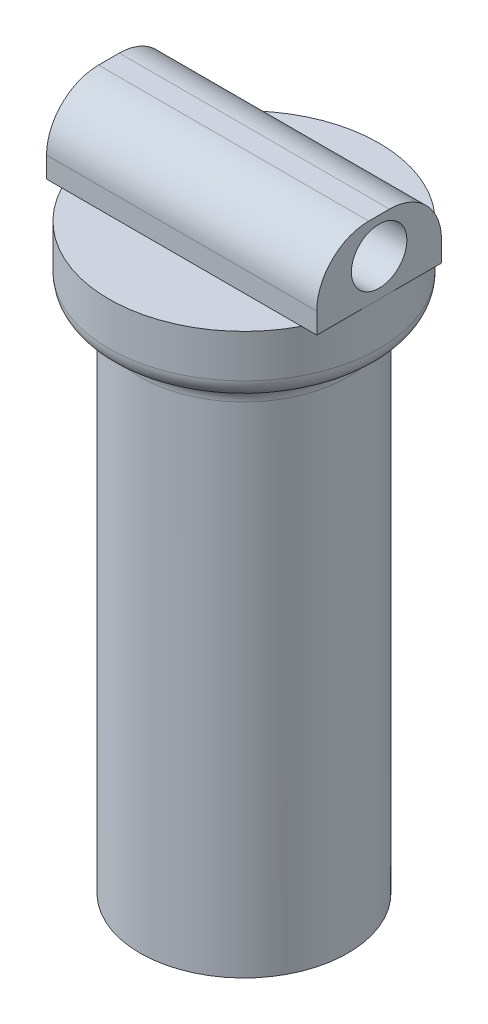
ISO-10303-21;
HEADER;
FILE_DESCRIPTION(('STEP AP214'),'2;1');
FILE_NAME('part.step','',(''),(''),'','','');
FILE_SCHEMA(('AUTOMOTIVE_DESIGN { 1 0 10303 214 1 1 1 1 }'));
ENDSEC;
DATA;
#1=APPLICATION_CONTEXT('core data for automotive mechanical design processes');
#2=APPLICATION_PROTOCOL_DEFINITION('international standard','automotive_design',2000,#1);
#3=PRODUCT_CONTEXT('',#1,'mechanical');
#4=PRODUCT('Part','Part','',(#3));
#5=PRODUCT_RELATED_PRODUCT_CATEGORY('part','',(#4));
#6=PRODUCT_DEFINITION_FORMATION('','',#4);
#7=PRODUCT_DEFINITION_CONTEXT('part definition',#1,'design');
#8=PRODUCT_DEFINITION('design','',#6,#7);
#9=PRODUCT_DEFINITION_SHAPE('','',#8);
#10=(LENGTH_UNIT() NAMED_UNIT(*) SI_UNIT(.MILLI.,.METRE.));
#11=(NAMED_UNIT(*) PLANE_ANGLE_UNIT() SI_UNIT($,.RADIAN.));
#12=(NAMED_UNIT(*) SI_UNIT($,.STERADIAN.) SOLID_ANGLE_UNIT());
#13=UNCERTAINTY_MEASURE_WITH_UNIT(LENGTH_MEASURE(1.E-05),#10,'distance_accuracy_value','');
#14=(GEOMETRIC_REPRESENTATION_CONTEXT(3) GLOBAL_UNCERTAINTY_ASSIGNED_CONTEXT((#13)) GLOBAL_UNIT_ASSIGNED_CONTEXT((#10,
#11,#12)) REPRESENTATION_CONTEXT('',''));
#15=CARTESIAN_POINT('',(0.,0.,0.));
#16=DIRECTION('',(0.,0.,1.));
#17=DIRECTION('',(1.,0.,0.));
#18=AXIS2_PLACEMENT_3D('',#15,#16,#17);
#19=CARTESIAN_POINT('',(-2.22044604925031E-13,29.9999999999999,0.));
#20=DIRECTION('',(0.,1.,0.));
#21=DIRECTION('',(0.,0.,1.));
#22=AXIS2_PLACEMENT_3D('',#19,#20,#21);
#23=PLANE('',#22);
#24=CARTESIAN_POINT('',(-2.22044604925031E-13,29.9999999999999,0.));
#25=DIRECTION('',(0.,1.,0.));
#26=DIRECTION('',(0.,0.,1.));
#27=AXIS2_PLACEMENT_3D('',#24,#25,#26);
#28=CIRCLE('',#27,65.);
#29=CARTESIAN_POINT('',(-57.6628129733541,29.9999999999999,30.0000000000002));
#30=VERTEX_POINT('',#29);
#31=CARTESIAN_POINT('',(57.6628129733539,30.,29.9999999999994));
#32=VERTEX_POINT('',#31);
#33=EDGE_CURVE('E134',#30,#32,#28,.T.);
#34=ORIENTED_EDGE('',*,*,#33,.T.);
#35=DIRECTION('',(-1.,0.,0.));
#36=VECTOR('',#35,1.);
#37=CARTESIAN_POINT('',(64.9999999999998,29.9999999999999,30.0000000000011));
#38=LINE('',#37,#36);
#39=EDGE_CURVE('E129',#32,#30,#38,.T.);
#40=ORIENTED_EDGE('',*,*,#39,.T.);
#41=EDGE_LOOP('',(#34,#40));
#42=FACE_BOUND('',#41,.T.);
#43=ADVANCED_FACE('F34',(#42),#23,.T.);
#44=CARTESIAN_POINT('',(-2.22044604925031E-13,29.9999999999999,0.));
#45=DIRECTION('',(0.,-1.,0.));
#46=DIRECTION('',(0.,0.,-1.));
#47=AXIS2_PLACEMENT_3D('',#44,#45,#46);
#48=CYLINDRICAL_SURFACE('',#47,65.);
#49=CARTESIAN_POINT('',(0.,9.36491673103706,0.));
#50=DIRECTION('',(0.,-1.,0.));
#51=DIRECTION('',(0.,0.,-1.));
#52=AXIS2_PLACEMENT_3D('',#49,#50,#51);
#53=CIRCLE('',#52,65.);
#54=CARTESIAN_POINT('',(0.,9.36491673103706,-65.));
#55=VERTEX_POINT('',#54);
#56=EDGE_CURVE('E147',#55,#55,#53,.F.);
#57=ORIENTED_EDGE('',*,*,#56,.T.);
#58=EDGE_LOOP('',(#57));
#59=FACE_BOUND('',#58,.T.);
#60=CARTESIAN_POINT('',(64.9999999999998,30.,8.88178419700125E-13));
#61=VERTEX_POINT('',#60);
#62=EDGE_CURVE('E123',#32,#61,#28,.T.);
#63=ORIENTED_EDGE('',*,*,#62,.F.);
#64=ORIENTED_EDGE('',*,*,#33,.F.);
#65=CARTESIAN_POINT('',(-65.0000000000004,29.9999999999999,0.));
#66=VERTEX_POINT('',#65);
#67=EDGE_CURVE('E207',#66,#30,#28,.T.);
#68=ORIENTED_EDGE('',*,*,#67,.F.);
#69=CARTESIAN_POINT('',(-57.6628129733541,30.,-30.0000000000002));
#70=VERTEX_POINT('',#69);
#71=EDGE_CURVE('E205',#70,#66,#28,.T.);
#72=ORIENTED_EDGE('',*,*,#71,.F.);
#73=CARTESIAN_POINT('',(57.6628129733539,30.,-29.9999999999985));
#74=VERTEX_POINT('',#73);
#75=EDGE_CURVE('E200',#74,#70,#28,.T.);
#76=ORIENTED_EDGE('',*,*,#75,.F.);
#77=EDGE_CURVE('E203',#61,#74,#28,.T.);
#78=ORIENTED_EDGE('',*,*,#77,.F.);
#79=EDGE_LOOP('',(#63,#64,#68,#72,#76,#78));
#80=FACE_BOUND('',#79,.T.);
#81=ADVANCED_FACE('F202',(#59,#80),#48,.T.);
#82=DIRECTION('',(-1.,0.,0.));
#83=VECTOR('',#82,1.);
#84=CARTESIAN_POINT('',(64.9999999999997,30.0000000000001,-30.0000000000002));
#85=LINE('',#84,#83);
#86=EDGE_CURVE('E139',#74,#70,#85,.T.);
#87=ORIENTED_EDGE('',*,*,#86,.F.);
#88=ORIENTED_EDGE('',*,*,#75,.T.);
#89=EDGE_LOOP('',(#87,#88));
#90=FACE_BOUND('',#89,.T.);
#91=ADVANCED_FACE('F199',(#90),#23,.T.);
#92=CARTESIAN_POINT('',(-1.11022302462516E-13,-250.,0.));
#93=DIRECTION('',(0.,1.,0.));
#94=DIRECTION('',(0.,0.,1.));
#95=AXIS2_PLACEMENT_3D('',#92,#93,#94);
#96=CYLINDRICAL_SURFACE('',#95,50.);
#97=CARTESIAN_POINT('',(-2.22044604925031E-13,-10.,0.));
#98=DIRECTION('',(0.,1.,0.));
#99=DIRECTION('',(0.,0.,1.));
#100=AXIS2_PLACEMENT_3D('',#97,#98,#99);
#101=CIRCLE('',#100,50.);
#102=CARTESIAN_POINT('',(-2.22044604925031E-13,-10.,50.));
#103=VERTEX_POINT('',#102);
#104=EDGE_CURVE('E152',#103,#103,#101,.F.);
#105=ORIENTED_EDGE('',*,*,#104,.T.);
#106=EDGE_LOOP('',(#105));
#107=FACE_BOUND('',#106,.T.);
#108=CARTESIAN_POINT('',(-1.11022302462516E-13,-250.,0.));
#109=DIRECTION('',(0.,-1.,0.));
#110=DIRECTION('',(0.,0.,-1.));
#111=AXIS2_PLACEMENT_3D('',#108,#109,#110);
#112=CIRCLE('',#111,50.);
#113=CARTESIAN_POINT('',(-1.11022302462516E-13,-250.,-50.));
#114=VERTEX_POINT('',#113);
#115=EDGE_CURVE('E130',#114,#114,#112,.T.);
#116=ORIENTED_EDGE('',*,*,#115,.F.);
#117=EDGE_LOOP('',(#116));
#118=FACE_BOUND('',#117,.T.);
#119=ADVANCED_FACE('F211',(#107,#118),#96,.T.);
#120=CARTESIAN_POINT('',(-1.11022302462516E-13,-250.,0.));
#121=DIRECTION('',(0.,-1.,0.));
#122=DIRECTION('',(0.,0.,-1.));
#123=AXIS2_PLACEMENT_3D('',#120,#121,#122);
#124=PLANE('',#123);
#125=ORIENTED_EDGE('',*,*,#115,.T.);
#126=EDGE_LOOP('',(#125));
#127=FACE_BOUND('',#126,.T.);
#128=ADVANCED_FACE('F217',(#127),#124,.T.);
#129=CARTESIAN_POINT('',(-2.22044604925031E-13,-10.,0.));
#130=DIRECTION('',(0.,1.,0.));
#131=DIRECTION('',(0.,0.,1.));
#132=AXIS2_PLACEMENT_3D('',#129,#130,#131);
#133=TOROIDAL_SURFACE('',#132,60.,10.);
#134=CARTESIAN_POINT('',(0.,-0.317541634481333,0.));
#135=DIRECTION('',(0.,-1.,0.));
#136=DIRECTION('',(0.,0.,-1.));
#137=AXIS2_PLACEMENT_3D('',#134,#135,#136);
#138=CIRCLE('',#137,57.5);
#139=CARTESIAN_POINT('',(0.,-0.317541634481334,-57.5));
#140=VERTEX_POINT('',#139);
#141=EDGE_CURVE('E140',#140,#140,#138,.T.);
#142=ORIENTED_EDGE('',*,*,#141,.T.);
#143=EDGE_LOOP('',(#142));
#144=FACE_BOUND('',#143,.T.);
#145=ORIENTED_EDGE('',*,*,#104,.F.);
#146=EDGE_LOOP('',(#145));
#147=FACE_BOUND('',#146,.T.);
#148=ADVANCED_FACE('F214',(#144,#147),#133,.F.);
#149=CARTESIAN_POINT('',(0.,9.36491673103706,0.));
#150=DIRECTION('',(0.,-1.,0.));
#151=DIRECTION('',(0.,0.,-1.));
#152=AXIS2_PLACEMENT_3D('',#149,#150,#151);
#153=TOROIDAL_SURFACE('',#152,55.,10.);
#154=ORIENTED_EDGE('',*,*,#141,.F.);
#155=EDGE_LOOP('',(#154));
#156=FACE_BOUND('',#155,.T.);
#157=ORIENTED_EDGE('',*,*,#56,.F.);
#158=EDGE_LOOP('',(#157));
#159=FACE_BOUND('',#158,.T.);
#160=ADVANCED_FACE('F216',(#156,#159),#153,.T.);
#161=CARTESIAN_POINT('',(64.9999999999998,29.9999999999999,30.0000000000011));
#162=DIRECTION('',(0.,1.,0.));
#163=DIRECTION('',(0.,0.,1.));
#164=AXIS2_PLACEMENT_3D('',#161,#162,#163);
#165=PLANE('',#164);
#166=CARTESIAN_POINT('',(64.9999999999998,29.9999999999999,30.0000000000011));
#167=VERTEX_POINT('',#166);
#168=EDGE_CURVE('E120',#167,#32,#38,.T.);
#169=ORIENTED_EDGE('',*,*,#168,.T.);
#170=ORIENTED_EDGE('',*,*,#62,.T.);
#171=DIRECTION('',(0.,0.,-1.));
#172=VECTOR('',#171,1.);
#173=CARTESIAN_POINT('',(64.9999999999998,29.9999999999999,30.0000000000011));
#174=LINE('',#173,#172);
#175=EDGE_CURVE('E109',#167,#61,#174,.T.);
#176=ORIENTED_EDGE('',*,*,#175,.F.);
#177=EDGE_LOOP('',(#169,#170,#176));
#178=FACE_BOUND('',#177,.T.);
#179=ADVANCED_FACE('F119',(#178),#165,.F.);
#180=CARTESIAN_POINT('',(64.9999999999997,30.0000000000001,-30.0000000000002));
#181=VERTEX_POINT('',#180);
#182=EDGE_CURVE('E114',#61,#181,#174,.T.);
#183=ORIENTED_EDGE('',*,*,#182,.F.);
#184=ORIENTED_EDGE('',*,*,#77,.T.);
#185=EDGE_CURVE('E137',#181,#74,#85,.T.);
#186=ORIENTED_EDGE('',*,*,#185,.F.);
#187=EDGE_LOOP('',(#183,#184,#186));
#188=FACE_BOUND('',#187,.T.);
#189=ADVANCED_FACE('F247',(#188),#165,.F.);
#190=CARTESIAN_POINT('',(-65.0000000000004,30.,-30.0000000000002));
#191=VERTEX_POINT('',#190);
#192=EDGE_CURVE('E145',#70,#191,#85,.T.);
#193=ORIENTED_EDGE('',*,*,#192,.F.);
#194=ORIENTED_EDGE('',*,*,#71,.T.);
#195=DIRECTION('',(0.,0.,-1.));
#196=VECTOR('',#195,1.);
#197=CARTESIAN_POINT('',(-65.0000000000004,29.9999999999999,29.9999999999994));
#198=LINE('',#197,#196);
#199=EDGE_CURVE('E188',#66,#191,#198,.T.);
#200=ORIENTED_EDGE('',*,*,#199,.T.);
#201=EDGE_LOOP('',(#193,#194,#200));
#202=FACE_BOUND('',#201,.T.);
#203=ADVANCED_FACE('F277',(#202),#165,.F.);
#204=CARTESIAN_POINT('',(-65.0000000000004,29.9999999999999,29.9999999999994));
#205=VERTEX_POINT('',#204);
#206=EDGE_CURVE('E184',#205,#66,#198,.T.);
#207=ORIENTED_EDGE('',*,*,#206,.T.);
#208=ORIENTED_EDGE('',*,*,#67,.T.);
#209=EDGE_CURVE('E131',#30,#205,#38,.T.);
#210=ORIENTED_EDGE('',*,*,#209,.T.);
#211=EDGE_LOOP('',(#207,#208,#210));
#212=FACE_BOUND('',#211,.T.);
#213=ADVANCED_FACE('F244',(#212),#165,.F.);
#214=CARTESIAN_POINT('',(64.9999999999998,29.9999999999999,30.0000000000011));
#215=DIRECTION('',(0.,0.,-1.));
#216=DIRECTION('',(-1.,0.,0.));
#217=AXIS2_PLACEMENT_3D('',#214,#215,#216);
#218=PLANE('',#217);
#219=DIRECTION('',(0.,-1.,0.));
#220=VECTOR('',#219,1.);
#221=CARTESIAN_POINT('',(64.9999999999998,29.9999999999999,30.0000000000011));
#222=LINE('',#221,#220);
#223=CARTESIAN_POINT('',(64.9999999999998,39.9999999999999,30.0000000000011));
#224=VERTEX_POINT('',#223);
#225=EDGE_CURVE('E106',#224,#167,#222,.T.);
#226=ORIENTED_EDGE('',*,*,#225,.F.);
#227=DIRECTION('',(-1.,0.,0.));
#228=VECTOR('',#227,1.);
#229=CARTESIAN_POINT('',(64.9999999999998,39.9999999999999,30.0000000000011));
#230=LINE('',#229,#228);
#231=CARTESIAN_POINT('',(-65.0000000000004,39.9999999999999,30.0000000000002));
#232=VERTEX_POINT('',#231);
#233=EDGE_CURVE('E11',#224,#232,#230,.T.);
#234=ORIENTED_EDGE('',*,*,#233,.T.);
#235=DIRECTION('',(0.,-1.,0.));
#236=VECTOR('',#235,1.);
#237=CARTESIAN_POINT('',(-65.0000000000004,29.9999999999999,29.9999999999994));
#238=LINE('',#237,#236);
#239=EDGE_CURVE('E272',#232,#205,#238,.T.);
#240=ORIENTED_EDGE('',*,*,#239,.T.);
#241=ORIENTED_EDGE('',*,*,#209,.F.);
#242=ORIENTED_EDGE('',*,*,#39,.F.);
#243=ORIENTED_EDGE('',*,*,#168,.F.);
#244=EDGE_LOOP('',(#226,#234,#240,#241,#242,#243));
#245=FACE_BOUND('',#244,.T.);
#246=ADVANCED_FACE('F127',(#245),#218,.F.);
#247=CARTESIAN_POINT('',(64.9999999999997,30.0000000000001,-30.0000000000002));
#248=DIRECTION('',(0.,0.,1.));
#249=DIRECTION('',(1.,0.,0.));
#250=AXIS2_PLACEMENT_3D('',#247,#248,#249);
#251=PLANE('',#250);
#252=DIRECTION('',(0.,1.,0.));
#253=VECTOR('',#252,1.);
#254=CARTESIAN_POINT('',(-65.0000000000004,30.,-30.0000000000002));
#255=LINE('',#254,#253);
#256=CARTESIAN_POINT('',(-65.0000000000002,40.,-30.0000000000002));
#257=VERTEX_POINT('',#256);
#258=EDGE_CURVE('E181',#191,#257,#255,.T.);
#259=ORIENTED_EDGE('',*,*,#258,.T.);
#260=DIRECTION('',(-1.,0.,0.));
#261=VECTOR('',#260,1.);
#262=CARTESIAN_POINT('',(64.9999999999997,40.,-30.0000000000002));
#263=LINE('',#262,#261);
#264=CARTESIAN_POINT('',(64.9999999999997,40.,-30.0000000000002));
#265=VERTEX_POINT('',#264);
#266=EDGE_CURVE('E57',#257,#265,#263,.F.);
#267=ORIENTED_EDGE('',*,*,#266,.T.);
#268=DIRECTION('',(0.,1.,0.));
#269=VECTOR('',#268,1.);
#270=CARTESIAN_POINT('',(64.9999999999997,30.0000000000001,-30.0000000000002));
#271=LINE('',#270,#269);
#272=EDGE_CURVE('E125',#181,#265,#271,.T.);
#273=ORIENTED_EDGE('',*,*,#272,.F.);
#274=ORIENTED_EDGE('',*,*,#185,.T.);
#275=ORIENTED_EDGE('',*,*,#86,.T.);
#276=ORIENTED_EDGE('',*,*,#192,.T.);
#277=EDGE_LOOP('',(#259,#267,#273,#274,#275,#276));
#278=FACE_BOUND('',#277,.T.);
#279=ADVANCED_FACE('F182',(#278),#251,.F.);
#280=CARTESIAN_POINT('',(64.9999999999999,64.9999999999999,30.0000000000002));
#281=DIRECTION('',(0.,-1.,0.));
#282=DIRECTION('',(0.,0.,-1.));
#283=AXIS2_PLACEMENT_3D('',#280,#281,#282);
#284=PLANE('',#283);
#285=DIRECTION('',(0.,0.,1.));
#286=VECTOR('',#285,1.);
#287=CARTESIAN_POINT('',(64.9999999999999,64.9999999999999,30.0000000000002));
#288=LINE('',#287,#286);
#289=CARTESIAN_POINT('',(64.9999999999998,64.9999999999999,-4.99999999999989));
#290=VERTEX_POINT('',#289);
#291=CARTESIAN_POINT('',(64.9999999999997,64.9999999999999,4.99999999999989));
#292=VERTEX_POINT('',#291);
#293=EDGE_CURVE('E167',#290,#292,#288,.T.);
#294=ORIENTED_EDGE('',*,*,#293,.F.);
#295=DIRECTION('',(-1.,0.,0.));
#296=VECTOR('',#295,1.);
#297=CARTESIAN_POINT('',(64.9999999999998,64.9999999999999,-4.99999999999989));
#298=LINE('',#297,#296);
#299=CARTESIAN_POINT('',(-65.0000000000004,65.0000000000001,-4.99999999999989));
#300=VERTEX_POINT('',#299);
#301=EDGE_CURVE('E157',#290,#300,#298,.T.);
#302=ORIENTED_EDGE('',*,*,#301,.T.);
#303=DIRECTION('',(0.,0.,1.));
#304=VECTOR('',#303,1.);
#305=CARTESIAN_POINT('',(-65.0000000000004,64.9999999999999,30.0000000000011));
#306=LINE('',#305,#304);
#307=CARTESIAN_POINT('',(-65.0000000000002,64.9999999999999,5.00000000000078));
#308=VERTEX_POINT('',#307);
#309=EDGE_CURVE('E115',#300,#308,#306,.T.);
#310=ORIENTED_EDGE('',*,*,#309,.T.);
#311=DIRECTION('',(-1.,0.,0.));
#312=VECTOR('',#311,1.);
#313=CARTESIAN_POINT('',(64.9999999999997,64.9999999999999,4.99999999999989));
#314=LINE('',#313,#312);
#315=EDGE_CURVE('E144',#308,#292,#314,.F.);
#316=ORIENTED_EDGE('',*,*,#315,.T.);
#317=EDGE_LOOP('',(#294,#302,#310,#316));
#318=FACE_BOUND('',#317,.T.);
#319=ADVANCED_FACE('F171',(#318),#284,.F.);
#320=CARTESIAN_POINT('',(64.9999999999998,0.,8.88178419700125E-13));
#321=DIRECTION('',(-1.,0.,0.));
#322=DIRECTION('',(0.,0.,1.));
#323=AXIS2_PLACEMENT_3D('',#320,#321,#322);
#324=PLANE('',#323);
#325=CARTESIAN_POINT('',(64.9999999999997,47.8974679292606,8.88178419700125E-13));
#326=DIRECTION('',(1.,0.,0.));
#327=DIRECTION('',(0.,0.,-1.));
#328=AXIS2_PLACEMENT_3D('',#325,#326,#327);
#329=CIRCLE('',#328,13.35);
#330=CARTESIAN_POINT('',(64.9999999999997,47.8974679292606,-13.3499999999991));
#331=VERTEX_POINT('',#330);
#332=EDGE_CURVE('E270',#331,#331,#329,.T.);
#333=ORIENTED_EDGE('',*,*,#332,.F.);
#334=EDGE_LOOP('',(#333));
#335=FACE_BOUND('',#334,.T.);
#336=ORIENTED_EDGE('',*,*,#272,.T.);
#337=CARTESIAN_POINT('',(64.9999999999999,40.,-4.99999999999989));
#338=DIRECTION('',(-1.,0.,0.));
#339=DIRECTION('',(0.,0.,1.));
#340=AXIS2_PLACEMENT_3D('',#337,#338,#339);
#341=CIRCLE('',#340,25.);
#342=EDGE_CURVE('E42',#265,#290,#341,.F.);
#343=ORIENTED_EDGE('',*,*,#342,.T.);
#344=ORIENTED_EDGE('',*,*,#293,.T.);
#345=CARTESIAN_POINT('',(64.9999999999998,39.9999999999999,4.99999999999989));
#346=DIRECTION('',(-1.,0.,0.));
#347=DIRECTION('',(0.,0.,1.));
#348=AXIS2_PLACEMENT_3D('',#345,#346,#347);
#349=CIRCLE('',#348,25.);
#350=EDGE_CURVE('E49',#292,#224,#349,.F.);
#351=ORIENTED_EDGE('',*,*,#350,.T.);
#352=ORIENTED_EDGE('',*,*,#225,.T.);
#353=ORIENTED_EDGE('',*,*,#175,.T.);
#354=ORIENTED_EDGE('',*,*,#182,.T.);
#355=EDGE_LOOP('',(#336,#343,#344,#351,#352,#353,#354));
#356=FACE_BOUND('',#355,.T.);
#357=ADVANCED_FACE('F108',(#335,#356),#324,.F.);
#358=CARTESIAN_POINT('',(-64.9999999999999,0.,-8.88178419700125E-13));
#359=DIRECTION('',(-1.,0.,0.));
#360=DIRECTION('',(0.,0.,1.));
#361=AXIS2_PLACEMENT_3D('',#358,#359,#360);
#362=PLANE('',#361);
#363=CARTESIAN_POINT('',(-65.0000000000002,47.8974679292605,0.));
#364=DIRECTION('',(1.,0.,0.));
#365=DIRECTION('',(0.,0.,-1.));
#366=AXIS2_PLACEMENT_3D('',#363,#364,#365);
#367=CIRCLE('',#366,13.35);
#368=CARTESIAN_POINT('',(-65.0000000000002,47.8974679292605,-13.35));
#369=VERTEX_POINT('',#368);
#370=EDGE_CURVE('E267',#369,#369,#367,.T.);
#371=ORIENTED_EDGE('',*,*,#370,.T.);
#372=EDGE_LOOP('',(#371));
#373=FACE_BOUND('',#372,.T.);
#374=ORIENTED_EDGE('',*,*,#309,.F.);
#375=CARTESIAN_POINT('',(-65.0000000000004,40.,-4.99999999999901));
#376=DIRECTION('',(-1.,0.,0.));
#377=DIRECTION('',(0.,0.,1.));
#378=AXIS2_PLACEMENT_3D('',#375,#376,#377);
#379=CIRCLE('',#378,25.);
#380=EDGE_CURVE('E162',#300,#257,#379,.T.);
#381=ORIENTED_EDGE('',*,*,#380,.T.);
#382=ORIENTED_EDGE('',*,*,#258,.F.);
#383=ORIENTED_EDGE('',*,*,#199,.F.);
#384=ORIENTED_EDGE('',*,*,#206,.F.);
#385=ORIENTED_EDGE('',*,*,#239,.F.);
#386=CARTESIAN_POINT('',(-65.0000000000004,39.9999999999999,5.00000000000167));
#387=DIRECTION('',(-1.,0.,0.));
#388=DIRECTION('',(0.,0.,1.));
#389=AXIS2_PLACEMENT_3D('',#386,#387,#388);
#390=CIRCLE('',#389,25.);
#391=EDGE_CURVE('E160',#232,#308,#390,.T.);
#392=ORIENTED_EDGE('',*,*,#391,.T.);
#393=EDGE_LOOP('',(#374,#381,#382,#383,#384,#385,#392));
#394=FACE_BOUND('',#393,.T.);
#395=ADVANCED_FACE('F179',(#373,#394),#362,.T.);
#396=CARTESIAN_POINT('',(-65.0000000000002,47.8974679292605,0.));
#397=DIRECTION('',(1.,0.,0.));
#398=DIRECTION('',(0.,0.,-1.));
#399=AXIS2_PLACEMENT_3D('',#396,#397,#398);
#400=CYLINDRICAL_SURFACE('',#399,13.35);
#401=ORIENTED_EDGE('',*,*,#370,.F.);
#402=EDGE_LOOP('',(#401));
#403=FACE_BOUND('',#402,.T.);
#404=ORIENTED_EDGE('',*,*,#332,.T.);
#405=EDGE_LOOP('',(#404));
#406=FACE_BOUND('',#405,.T.);
#407=ADVANCED_FACE('F254',(#403,#406),#400,.F.);
#408=CARTESIAN_POINT('',(64.9999999999999,40.,-4.99999999999989));
#409=DIRECTION('',(-1.,0.,0.));
#410=DIRECTION('',(0.,0.,1.));
#411=AXIS2_PLACEMENT_3D('',#408,#409,#410);
#412=CYLINDRICAL_SURFACE('',#411,25.);
#413=ORIENTED_EDGE('',*,*,#342,.F.);
#414=ORIENTED_EDGE('',*,*,#266,.F.);
#415=ORIENTED_EDGE('',*,*,#380,.F.);
#416=ORIENTED_EDGE('',*,*,#301,.F.);
#417=EDGE_LOOP('',(#413,#414,#415,#416));
#418=FACE_BOUND('',#417,.T.);
#419=ADVANCED_FACE('F176',(#418),#412,.T.);
#420=CARTESIAN_POINT('',(64.9999999999998,39.9999999999999,4.99999999999989));
#421=DIRECTION('',(-1.,0.,0.));
#422=DIRECTION('',(0.,0.,1.));
#423=AXIS2_PLACEMENT_3D('',#420,#421,#422);
#424=CYLINDRICAL_SURFACE('',#423,25.);
#425=ORIENTED_EDGE('',*,*,#350,.F.);
#426=ORIENTED_EDGE('',*,*,#315,.F.);
#427=ORIENTED_EDGE('',*,*,#391,.F.);
#428=ORIENTED_EDGE('',*,*,#233,.F.);
#429=EDGE_LOOP('',(#425,#426,#427,#428));
#430=FACE_BOUND('',#429,.T.);
#431=ADVANCED_FACE('F36',(#430),#424,.T.);
#432=CLOSED_SHELL('',(#43,#81,#91,#119,#128,#148,#160,#179,#189,#203,#213,#246,#279,#319,#357,
#395,#407,#419,#431));
#433=MANIFOLD_SOLID_BREP('B2',#432);
#434=ADVANCED_BREP_SHAPE_REPRESENTATION('',(#18,#433),#14);
#435=SHAPE_DEFINITION_REPRESENTATION(#9,#434);
ENDSEC;
END-ISO-10303-21;
